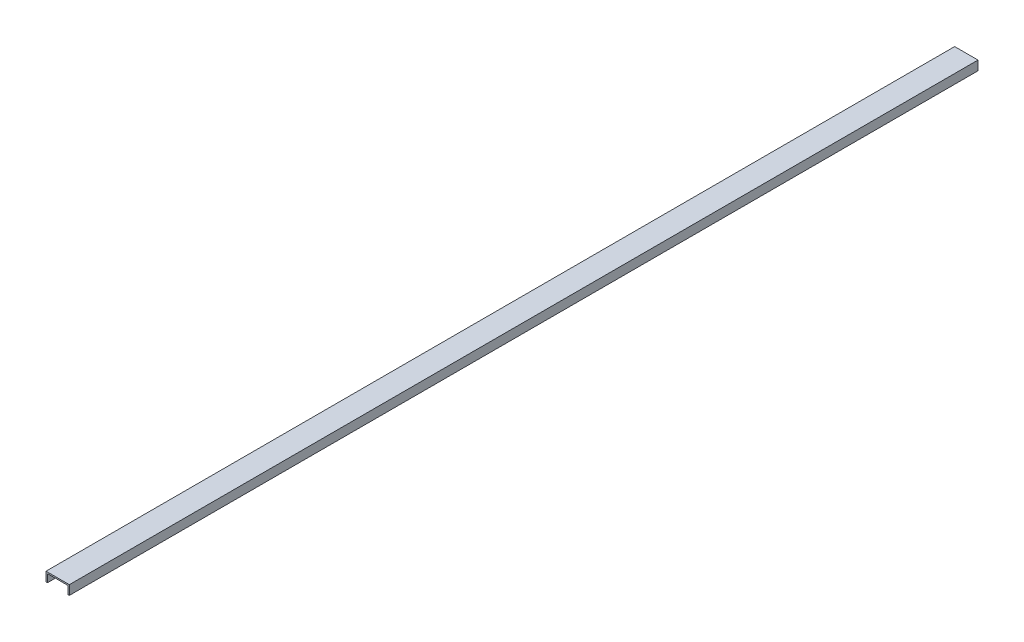
ISO-10303-21;
HEADER;
FILE_DESCRIPTION(('STEP AP214'),'2;1');
FILE_NAME('part.step','',(''),(''),'','','');
FILE_SCHEMA(('AUTOMOTIVE_DESIGN { 1 0 10303 214 1 1 1 1 }'));
ENDSEC;
DATA;
#1=APPLICATION_CONTEXT('core data for automotive mechanical design processes');
#2=APPLICATION_PROTOCOL_DEFINITION('international standard','automotive_design',2000,#1);
#3=PRODUCT_CONTEXT('',#1,'mechanical');
#4=PRODUCT('Part','Part','',(#3));
#5=PRODUCT_RELATED_PRODUCT_CATEGORY('part','',(#4));
#6=PRODUCT_DEFINITION_FORMATION('','',#4);
#7=PRODUCT_DEFINITION_CONTEXT('part definition',#1,'design');
#8=PRODUCT_DEFINITION('design','',#6,#7);
#9=PRODUCT_DEFINITION_SHAPE('','',#8);
#10=(LENGTH_UNIT() NAMED_UNIT(*) SI_UNIT(.MILLI.,.METRE.));
#11=(NAMED_UNIT(*) PLANE_ANGLE_UNIT() SI_UNIT($,.RADIAN.));
#12=(NAMED_UNIT(*) SI_UNIT($,.STERADIAN.) SOLID_ANGLE_UNIT());
#13=UNCERTAINTY_MEASURE_WITH_UNIT(LENGTH_MEASURE(1.E-05),#10,'distance_accuracy_value','');
#14=(GEOMETRIC_REPRESENTATION_CONTEXT(3) GLOBAL_UNCERTAINTY_ASSIGNED_CONTEXT((#13)) GLOBAL_UNIT_ASSIGNED_CONTEXT((#10,
#11,#12)) REPRESENTATION_CONTEXT('',''));
#15=CARTESIAN_POINT('',(0.,0.,0.));
#16=DIRECTION('',(0.,0.,1.));
#17=DIRECTION('',(1.,0.,0.));
#18=AXIS2_PLACEMENT_3D('',#15,#16,#17);
#19=CARTESIAN_POINT('',(3.,0.,1825.));
#20=DIRECTION('',(0.,1.,0.));
#21=DIRECTION('',(-1.,0.,0.));
#22=AXIS2_PLACEMENT_3D('',#19,#20,#21);
#23=PLANE('',#22);
#24=DIRECTION('',(0.,0.,-1.));
#25=VECTOR('',#24,1.);
#26=CARTESIAN_POINT('',(0.,0.,1825.));
#27=LINE('',#26,#25);
#28=CARTESIAN_POINT('',(0.,0.,1872.));
#29=VERTEX_POINT('',#28);
#30=CARTESIAN_POINT('',(0.,0.,-75.));
#31=VERTEX_POINT('',#30);
#32=EDGE_CURVE('E47',#29,#31,#27,.T.);
#33=ORIENTED_EDGE('',*,*,#32,.T.);
#34=DIRECTION('',(-1.,0.,0.));
#35=VECTOR('',#34,1.);
#36=CARTESIAN_POINT('',(0.,0.,-75.));
#37=LINE('',#36,#35);
#38=CARTESIAN_POINT('',(3.,0.,-75.));
#39=VERTEX_POINT('',#38);
#40=EDGE_CURVE('E130',#39,#31,#37,.T.);
#41=ORIENTED_EDGE('',*,*,#40,.F.);
#42=DIRECTION('',(0.,0.,-1.));
#43=VECTOR('',#42,1.);
#44=CARTESIAN_POINT('',(3.,0.,1825.));
#45=LINE('',#44,#43);
#46=CARTESIAN_POINT('',(3.,0.,1872.));
#47=VERTEX_POINT('',#46);
#48=EDGE_CURVE('E11',#47,#39,#45,.T.);
#49=ORIENTED_EDGE('',*,*,#48,.F.);
#50=DIRECTION('',(1.,0.,0.));
#51=VECTOR('',#50,1.);
#52=CARTESIAN_POINT('',(3.,0.,1872.));
#53=LINE('',#52,#51);
#54=EDGE_CURVE('E139',#29,#47,#53,.T.);
#55=ORIENTED_EDGE('',*,*,#54,.F.);
#56=EDGE_LOOP('',(#33,#41,#49,#55));
#57=FACE_BOUND('',#56,.T.);
#58=ADVANCED_FACE('F33',(#57),#23,.F.);
#59=CARTESIAN_POINT('',(2.99999999999999,17.,1825.));
#60=DIRECTION('',(-1.,0.,0.));
#61=DIRECTION('',(0.,-1.,0.));
#62=AXIS2_PLACEMENT_3D('',#59,#60,#61);
#63=PLANE('',#62);
#64=ORIENTED_EDGE('',*,*,#48,.T.);
#65=DIRECTION('',(0.,-1.,0.));
#66=VECTOR('',#65,1.);
#67=CARTESIAN_POINT('',(3.,0.,-75.));
#68=LINE('',#67,#66);
#69=CARTESIAN_POINT('',(2.99999999999999,17.,-75.));
#70=VERTEX_POINT('',#69);
#71=EDGE_CURVE('E127',#70,#39,#68,.T.);
#72=ORIENTED_EDGE('',*,*,#71,.F.);
#73=DIRECTION('',(0.,0.,-1.));
#74=VECTOR('',#73,1.);
#75=CARTESIAN_POINT('',(2.99999999999999,17.,1825.));
#76=LINE('',#75,#74);
#77=CARTESIAN_POINT('',(2.99999999999999,17.,1872.));
#78=VERTEX_POINT('',#77);
#79=EDGE_CURVE('E40',#78,#70,#76,.T.);
#80=ORIENTED_EDGE('',*,*,#79,.F.);
#81=DIRECTION('',(0.,1.,0.));
#82=VECTOR('',#81,1.);
#83=CARTESIAN_POINT('',(2.99999999999999,17.,1872.));
#84=LINE('',#83,#82);
#85=EDGE_CURVE('E142',#47,#78,#84,.T.);
#86=ORIENTED_EDGE('',*,*,#85,.F.);
#87=EDGE_LOOP('',(#64,#72,#80,#86));
#88=FACE_BOUND('',#87,.T.);
#89=ADVANCED_FACE('F170',(#88),#63,.F.);
#90=CARTESIAN_POINT('',(47.,17.,1825.));
#91=DIRECTION('',(0.,1.,0.));
#92=DIRECTION('',(-1.,0.,0.));
#93=AXIS2_PLACEMENT_3D('',#90,#91,#92);
#94=PLANE('',#93);
#95=ORIENTED_EDGE('',*,*,#79,.T.);
#96=DIRECTION('',(-1.,0.,0.));
#97=VECTOR('',#96,1.);
#98=CARTESIAN_POINT('',(2.99999999999999,17.,-75.));
#99=LINE('',#98,#97);
#100=CARTESIAN_POINT('',(47.,17.,-75.));
#101=VERTEX_POINT('',#100);
#102=EDGE_CURVE('E117',#101,#70,#99,.T.);
#103=ORIENTED_EDGE('',*,*,#102,.F.);
#104=DIRECTION('',(0.,0.,-1.));
#105=VECTOR('',#104,1.);
#106=CARTESIAN_POINT('',(47.,17.,1825.));
#107=LINE('',#106,#105);
#108=CARTESIAN_POINT('',(47.,17.,1872.));
#109=VERTEX_POINT('',#108);
#110=EDGE_CURVE('E108',#109,#101,#107,.T.);
#111=ORIENTED_EDGE('',*,*,#110,.F.);
#112=DIRECTION('',(1.,0.,0.));
#113=VECTOR('',#112,1.);
#114=CARTESIAN_POINT('',(47.,17.,1872.));
#115=LINE('',#114,#113);
#116=EDGE_CURVE('E145',#78,#109,#115,.T.);
#117=ORIENTED_EDGE('',*,*,#116,.F.);
#118=EDGE_LOOP('',(#95,#103,#111,#117));
#119=FACE_BOUND('',#118,.T.);
#120=ADVANCED_FACE('F165',(#119),#94,.F.);
#121=CARTESIAN_POINT('',(47.,0.,1825.));
#122=DIRECTION('',(1.,0.,0.));
#123=DIRECTION('',(0.,0.,-1.));
#124=AXIS2_PLACEMENT_3D('',#121,#122,#123);
#125=PLANE('',#124);
#126=ORIENTED_EDGE('',*,*,#110,.T.);
#127=DIRECTION('',(0.,1.,0.));
#128=VECTOR('',#127,1.);
#129=CARTESIAN_POINT('',(47.,17.,-75.));
#130=LINE('',#129,#128);
#131=CARTESIAN_POINT('',(47.,0.,-75.));
#132=VERTEX_POINT('',#131);
#133=EDGE_CURVE('E112',#132,#101,#130,.T.);
#134=ORIENTED_EDGE('',*,*,#133,.F.);
#135=DIRECTION('',(0.,0.,-1.));
#136=VECTOR('',#135,1.);
#137=CARTESIAN_POINT('',(47.,0.,1825.));
#138=LINE('',#137,#136);
#139=CARTESIAN_POINT('',(47.,0.,1872.));
#140=VERTEX_POINT('',#139);
#141=EDGE_CURVE('E98',#140,#132,#138,.T.);
#142=ORIENTED_EDGE('',*,*,#141,.F.);
#143=DIRECTION('',(0.,-1.,0.));
#144=VECTOR('',#143,1.);
#145=CARTESIAN_POINT('',(47.,0.,1872.));
#146=LINE('',#145,#144);
#147=EDGE_CURVE('E148',#109,#140,#146,.T.);
#148=ORIENTED_EDGE('',*,*,#147,.F.);
#149=EDGE_LOOP('',(#126,#134,#142,#148));
#150=FACE_BOUND('',#149,.T.);
#151=ADVANCED_FACE('F113',(#150),#125,.F.);
#152=CARTESIAN_POINT('',(50.,0.,1825.));
#153=DIRECTION('',(0.,1.,0.));
#154=DIRECTION('',(-1.,0.,0.));
#155=AXIS2_PLACEMENT_3D('',#152,#153,#154);
#156=PLANE('',#155);
#157=ORIENTED_EDGE('',*,*,#141,.T.);
#158=DIRECTION('',(-1.,0.,0.));
#159=VECTOR('',#158,1.);
#160=CARTESIAN_POINT('',(47.,0.,-75.));
#161=LINE('',#160,#159);
#162=CARTESIAN_POINT('',(50.,0.,-75.));
#163=VERTEX_POINT('',#162);
#164=EDGE_CURVE('E102',#163,#132,#161,.T.);
#165=ORIENTED_EDGE('',*,*,#164,.F.);
#166=DIRECTION('',(0.,0.,-1.));
#167=VECTOR('',#166,1.);
#168=CARTESIAN_POINT('',(50.,0.,1825.));
#169=LINE('',#168,#167);
#170=CARTESIAN_POINT('',(50.,0.,1872.));
#171=VERTEX_POINT('',#170);
#172=EDGE_CURVE('E109',#171,#163,#169,.T.);
#173=ORIENTED_EDGE('',*,*,#172,.F.);
#174=DIRECTION('',(1.,0.,0.));
#175=VECTOR('',#174,1.);
#176=CARTESIAN_POINT('',(50.,0.,1872.));
#177=LINE('',#176,#175);
#178=EDGE_CURVE('E104',#140,#171,#177,.T.);
#179=ORIENTED_EDGE('',*,*,#178,.F.);
#180=EDGE_LOOP('',(#157,#165,#173,#179));
#181=FACE_BOUND('',#180,.T.);
#182=ADVANCED_FACE('F100',(#181),#156,.F.);
#183=CARTESIAN_POINT('',(50.,20.,1825.));
#184=DIRECTION('',(-1.,0.,0.));
#185=DIRECTION('',(0.,0.,1.));
#186=AXIS2_PLACEMENT_3D('',#183,#184,#185);
#187=PLANE('',#186);
#188=ORIENTED_EDGE('',*,*,#172,.T.);
#189=DIRECTION('',(0.,-1.,0.));
#190=VECTOR('',#189,1.);
#191=CARTESIAN_POINT('',(50.,0.,-75.));
#192=LINE('',#191,#190);
#193=CARTESIAN_POINT('',(50.,20.,-75.));
#194=VERTEX_POINT('',#193);
#195=EDGE_CURVE('E123',#194,#163,#192,.T.);
#196=ORIENTED_EDGE('',*,*,#195,.F.);
#197=DIRECTION('',(0.,0.,-1.));
#198=VECTOR('',#197,1.);
#199=CARTESIAN_POINT('',(50.,20.,1825.));
#200=LINE('',#199,#198);
#201=CARTESIAN_POINT('',(50.,20.,1872.));
#202=VERTEX_POINT('',#201);
#203=EDGE_CURVE('E160',#202,#194,#200,.T.);
#204=ORIENTED_EDGE('',*,*,#203,.F.);
#205=DIRECTION('',(0.,1.,0.));
#206=VECTOR('',#205,1.);
#207=CARTESIAN_POINT('',(50.,20.,1872.));
#208=LINE('',#207,#206);
#209=EDGE_CURVE('E151',#171,#202,#208,.T.);
#210=ORIENTED_EDGE('',*,*,#209,.F.);
#211=EDGE_LOOP('',(#188,#196,#204,#210));
#212=FACE_BOUND('',#211,.T.);
#213=ADVANCED_FACE('F179',(#212),#187,.F.);
#214=CARTESIAN_POINT('',(0.,20.,1825.));
#215=DIRECTION('',(0.,-1.,0.));
#216=DIRECTION('',(0.,0.,-1.));
#217=AXIS2_PLACEMENT_3D('',#214,#215,#216);
#218=PLANE('',#217);
#219=ORIENTED_EDGE('',*,*,#203,.T.);
#220=DIRECTION('',(1.,0.,0.));
#221=VECTOR('',#220,1.);
#222=CARTESIAN_POINT('',(50.,20.,-75.));
#223=LINE('',#222,#221);
#224=CARTESIAN_POINT('',(0.,20.,-75.));
#225=VERTEX_POINT('',#224);
#226=EDGE_CURVE('E136',#225,#194,#223,.T.);
#227=ORIENTED_EDGE('',*,*,#226,.F.);
#228=DIRECTION('',(0.,0.,-1.));
#229=VECTOR('',#228,1.);
#230=CARTESIAN_POINT('',(0.,20.,1825.));
#231=LINE('',#230,#229);
#232=CARTESIAN_POINT('',(0.,20.,1872.));
#233=VERTEX_POINT('',#232);
#234=EDGE_CURVE('E55',#233,#225,#231,.T.);
#235=ORIENTED_EDGE('',*,*,#234,.F.);
#236=DIRECTION('',(-1.,0.,0.));
#237=VECTOR('',#236,1.);
#238=CARTESIAN_POINT('',(0.,20.,1872.));
#239=LINE('',#238,#237);
#240=EDGE_CURVE('E154',#202,#233,#239,.T.);
#241=ORIENTED_EDGE('',*,*,#240,.F.);
#242=EDGE_LOOP('',(#219,#227,#235,#241));
#243=FACE_BOUND('',#242,.T.);
#244=ADVANCED_FACE('F177',(#243),#218,.F.);
#245=CARTESIAN_POINT('',(0.,0.,1825.));
#246=DIRECTION('',(1.,0.,0.));
#247=DIRECTION('',(0.,0.,-1.));
#248=AXIS2_PLACEMENT_3D('',#245,#246,#247);
#249=PLANE('',#248);
#250=ORIENTED_EDGE('',*,*,#234,.T.);
#251=DIRECTION('',(0.,1.,0.));
#252=VECTOR('',#251,1.);
#253=CARTESIAN_POINT('',(0.,20.,-75.));
#254=LINE('',#253,#252);
#255=EDGE_CURVE('E133',#31,#225,#254,.T.);
#256=ORIENTED_EDGE('',*,*,#255,.F.);
#257=ORIENTED_EDGE('',*,*,#32,.F.);
#258=DIRECTION('',(0.,-1.,0.));
#259=VECTOR('',#258,1.);
#260=CARTESIAN_POINT('',(0.,0.,1872.));
#261=LINE('',#260,#259);
#262=EDGE_CURVE('E156',#233,#29,#261,.T.);
#263=ORIENTED_EDGE('',*,*,#262,.F.);
#264=EDGE_LOOP('',(#250,#256,#257,#263));
#265=FACE_BOUND('',#264,.T.);
#266=ADVANCED_FACE('F173',(#265),#249,.F.);
#267=CARTESIAN_POINT('',(0.,0.,1872.));
#268=DIRECTION('',(0.,0.,-1.));
#269=DIRECTION('',(-1.,0.,0.));
#270=AXIS2_PLACEMENT_3D('',#267,#268,#269);
#271=PLANE('',#270);
#272=ORIENTED_EDGE('',*,*,#54,.T.);
#273=ORIENTED_EDGE('',*,*,#85,.T.);
#274=ORIENTED_EDGE('',*,*,#116,.T.);
#275=ORIENTED_EDGE('',*,*,#147,.T.);
#276=ORIENTED_EDGE('',*,*,#178,.T.);
#277=ORIENTED_EDGE('',*,*,#209,.T.);
#278=ORIENTED_EDGE('',*,*,#240,.T.);
#279=ORIENTED_EDGE('',*,*,#262,.T.);
#280=EDGE_LOOP('',(#272,#273,#274,#275,#276,#277,#278,#279));
#281=FACE_BOUND('',#280,.T.);
#282=ADVANCED_FACE('F175',(#281),#271,.F.);
#283=CARTESIAN_POINT('',(0.,0.,-75.));
#284=DIRECTION('',(0.,0.,1.));
#285=DIRECTION('',(1.,0.,0.));
#286=AXIS2_PLACEMENT_3D('',#283,#284,#285);
#287=PLANE('',#286);
#288=ORIENTED_EDGE('',*,*,#164,.T.);
#289=ORIENTED_EDGE('',*,*,#133,.T.);
#290=ORIENTED_EDGE('',*,*,#102,.T.);
#291=ORIENTED_EDGE('',*,*,#71,.T.);
#292=ORIENTED_EDGE('',*,*,#40,.T.);
#293=ORIENTED_EDGE('',*,*,#255,.T.);
#294=ORIENTED_EDGE('',*,*,#226,.T.);
#295=ORIENTED_EDGE('',*,*,#195,.T.);
#296=EDGE_LOOP('',(#288,#289,#290,#291,#292,#293,#294,#295));
#297=FACE_BOUND('',#296,.T.);
#298=ADVANCED_FACE('F120',(#297),#287,.F.);
#299=CLOSED_SHELL('',(#58,#89,#120,#151,#182,#213,#244,#266,#282,#298));
#300=MANIFOLD_SOLID_BREP('B2',#299);
#301=ADVANCED_BREP_SHAPE_REPRESENTATION('',(#18,#300),#14);
#302=SHAPE_DEFINITION_REPRESENTATION(#9,#301);
ENDSEC;
END-ISO-10303-21;
